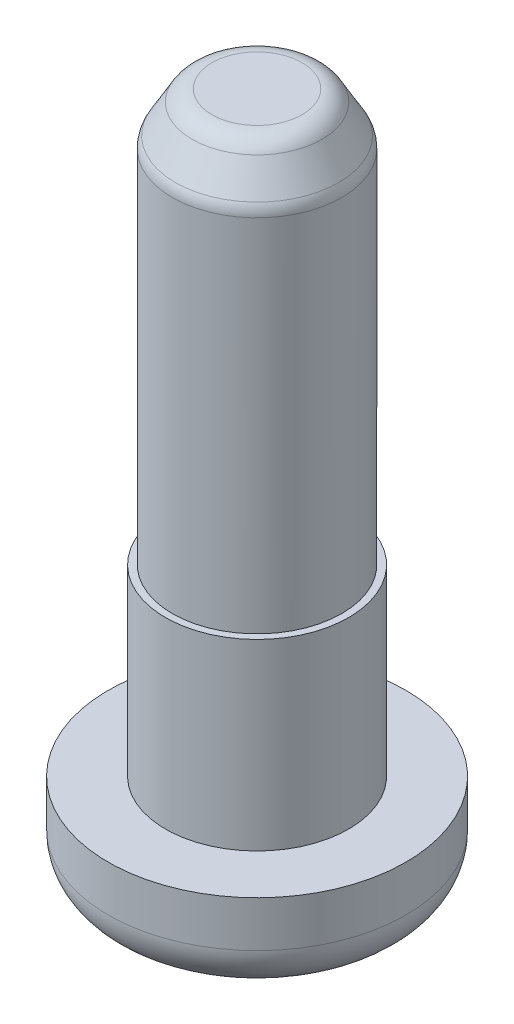
ISO-10303-21;
HEADER;
FILE_DESCRIPTION(('STEP AP214'),'2;1');
FILE_NAME('part.step','',(''),(''),'','','');
FILE_SCHEMA(('AUTOMOTIVE_DESIGN { 1 0 10303 214 1 1 1 1 }'));
ENDSEC;
DATA;
#1=APPLICATION_CONTEXT('core data for automotive mechanical design processes');
#2=APPLICATION_PROTOCOL_DEFINITION('international standard','automotive_design',2000,#1);
#3=PRODUCT_CONTEXT('',#1,'mechanical');
#4=PRODUCT('Part','Part','',(#3));
#5=PRODUCT_RELATED_PRODUCT_CATEGORY('part','',(#4));
#6=PRODUCT_DEFINITION_FORMATION('','',#4);
#7=PRODUCT_DEFINITION_CONTEXT('part definition',#1,'design');
#8=PRODUCT_DEFINITION('design','',#6,#7);
#9=PRODUCT_DEFINITION_SHAPE('','',#8);
#10=(LENGTH_UNIT() NAMED_UNIT(*) SI_UNIT(.MILLI.,.METRE.));
#11=(NAMED_UNIT(*) PLANE_ANGLE_UNIT() SI_UNIT($,.RADIAN.));
#12=(NAMED_UNIT(*) SI_UNIT($,.STERADIAN.) SOLID_ANGLE_UNIT());
#13=UNCERTAINTY_MEASURE_WITH_UNIT(LENGTH_MEASURE(1.E-05),#10,'distance_accuracy_value','');
#14=(GEOMETRIC_REPRESENTATION_CONTEXT(3) GLOBAL_UNCERTAINTY_ASSIGNED_CONTEXT((#13)) GLOBAL_UNIT_ASSIGNED_CONTEXT((#10,
#11,#12)) REPRESENTATION_CONTEXT('',''));
#15=CARTESIAN_POINT('',(0.,0.,0.));
#16=DIRECTION('',(0.,0.,1.));
#17=DIRECTION('',(1.,0.,0.));
#18=AXIS2_PLACEMENT_3D('',#15,#16,#17);
#19=CARTESIAN_POINT('',(0.,26.,0.));
#20=DIRECTION('',(0.,-1.,0.));
#21=DIRECTION('',(0.,0.,-1.));
#22=AXIS2_PLACEMENT_3D('',#19,#20,#21);
#23=CYLINDRICAL_SURFACE('',#22,4.);
#24=CARTESIAN_POINT('',(0.,8.,0.));
#25=DIRECTION('',(0.,-1.,0.));
#26=DIRECTION('',(0.,0.,-1.));
#27=AXIS2_PLACEMENT_3D('',#24,#25,#26);
#28=CIRCLE('',#27,4.);
#29=CARTESIAN_POINT('',(0.,8.,-4.));
#30=VERTEX_POINT('',#29);
#31=EDGE_CURVE('E67',#30,#30,#28,.F.);
#32=CARTESIAN_POINT('',(0.,0.,0.));
#33=DIRECTION('',(0.,1.,0.));
#34=DIRECTION('',(0.,0.,1.));
#35=AXIS2_PLACEMENT_3D('',#32,#33,#34);
#36=CIRCLE('',#35,4.);
#37=CARTESIAN_POINT('',(0.,0.,-4.));
#38=VERTEX_POINT('',#37);
#39=EDGE_CURVE('E60',#38,#38,#36,.T.);
#40=CARTESIAN_POINT('',(0.,8.,-4.));
#41=CARTESIAN_POINT('',(0.,7.91666666666667,-4.));
#42=CARTESIAN_POINT('',(0.,7.83333333333333,-4.));
#43=CARTESIAN_POINT('',(0.,7.66666666666667,-4.));
#44=CARTESIAN_POINT('',(0.,7.58333333333333,-4.));
#45=CARTESIAN_POINT('',(0.,7.41666666666667,-4.));
#46=CARTESIAN_POINT('',(0.,7.33333333333333,-4.));
#47=CARTESIAN_POINT('',(0.,7.16666666666667,-4.));
#48=CARTESIAN_POINT('',(0.,7.08333333333333,-4.));
#49=CARTESIAN_POINT('',(0.,6.91666666666667,-4.));
#50=CARTESIAN_POINT('',(0.,6.83333333333333,-4.));
#51=CARTESIAN_POINT('',(0.,6.66666666666667,-4.));
#52=CARTESIAN_POINT('',(0.,6.58333333333333,-4.));
#53=CARTESIAN_POINT('',(0.,6.41666666666667,-4.));
#54=CARTESIAN_POINT('',(0.,6.33333333333333,-4.));
#55=CARTESIAN_POINT('',(0.,6.16666666666667,-4.));
#56=CARTESIAN_POINT('',(0.,6.08333333333333,-4.));
#57=CARTESIAN_POINT('',(0.,5.91666666666666,-4.));
#58=CARTESIAN_POINT('',(0.,5.83333333333333,-4.));
#59=CARTESIAN_POINT('',(0.,5.66666666666667,-4.));
#60=CARTESIAN_POINT('',(0.,5.58333333333333,-4.));
#61=CARTESIAN_POINT('',(0.,5.41666666666667,-4.));
#62=CARTESIAN_POINT('',(0.,5.33333333333333,-4.));
#63=CARTESIAN_POINT('',(0.,5.16666666666667,-4.));
#64=CARTESIAN_POINT('',(0.,5.08333333333333,-4.));
#65=CARTESIAN_POINT('',(0.,4.91666666666667,-4.));
#66=CARTESIAN_POINT('',(0.,4.83333333333333,-4.));
#67=CARTESIAN_POINT('',(0.,4.66666666666667,-4.));
#68=CARTESIAN_POINT('',(0.,4.58333333333333,-4.));
#69=CARTESIAN_POINT('',(0.,4.41666666666667,-4.));
#70=CARTESIAN_POINT('',(0.,4.33333333333333,-4.));
#71=CARTESIAN_POINT('',(0.,4.16666666666667,-4.));
#72=CARTESIAN_POINT('',(0.,4.08333333333333,-4.));
#73=CARTESIAN_POINT('',(0.,3.91666666666667,-4.));
#74=CARTESIAN_POINT('',(0.,3.83333333333333,-4.));
#75=CARTESIAN_POINT('',(0.,3.66666666666667,-4.));
#76=CARTESIAN_POINT('',(0.,3.58333333333333,-4.));
#77=CARTESIAN_POINT('',(0.,3.41666666666667,-4.));
#78=CARTESIAN_POINT('',(0.,3.33333333333333,-4.));
#79=CARTESIAN_POINT('',(0.,3.16666666666667,-4.));
#80=CARTESIAN_POINT('',(0.,3.08333333333333,-4.));
#81=CARTESIAN_POINT('',(0.,2.91666666666667,-4.));
#82=CARTESIAN_POINT('',(0.,2.83333333333333,-4.));
#83=CARTESIAN_POINT('',(0.,2.66666666666667,-4.));
#84=CARTESIAN_POINT('',(0.,2.58333333333333,-4.));
#85=CARTESIAN_POINT('',(0.,2.41666666666667,-4.));
#86=CARTESIAN_POINT('',(0.,2.33333333333334,-4.));
#87=CARTESIAN_POINT('',(0.,2.16666666666667,-4.));
#88=CARTESIAN_POINT('',(0.,2.08333333333334,-4.));
#89=CARTESIAN_POINT('',(0.,1.91666666666667,-4.));
#90=CARTESIAN_POINT('',(0.,1.83333333333334,-4.));
#91=CARTESIAN_POINT('',(0.,1.66666666666667,-4.));
#92=CARTESIAN_POINT('',(0.,1.58333333333333,-4.));
#93=CARTESIAN_POINT('',(0.,1.41666666666667,-4.));
#94=CARTESIAN_POINT('',(0.,1.33333333333333,-4.));
#95=CARTESIAN_POINT('',(0.,1.16666666666667,-4.));
#96=CARTESIAN_POINT('',(0.,1.08333333333333,-4.));
#97=CARTESIAN_POINT('',(0.,0.916666666666668,-4.));
#98=CARTESIAN_POINT('',(0.,0.833333333333334,-4.));
#99=CARTESIAN_POINT('',(0.,0.666666666666667,-4.));
#100=CARTESIAN_POINT('',(0.,0.583333333333334,-4.));
#101=CARTESIAN_POINT('',(0.,0.416666666666667,-4.));
#102=CARTESIAN_POINT('',(0.,0.333333333333334,-4.));
#103=CARTESIAN_POINT('',(0.,0.166666666666667,-4.));
#104=CARTESIAN_POINT('',(0.,0.0833333333333333,-4.));
#105=CARTESIAN_POINT('',(0.,0.,-4.));
#106=B_SPLINE_CURVE_WITH_KNOTS('',3,(#40,#41,#42,#43,#44,#45,#46,#47,#48,#49,#50,#51,#52,#53,
#54,#55,#56,#57,#58,#59,#60,#61,#62,#63,#64,#65,#66,#67,#68,#69,#70,#71,#72,#73,#74,#75,#76,#77,
#78,#79,#80,#81,#82,#83,#84,#85,#86,#87,#88,#89,#90,#91,#92,#93,#94,#95,#96,#97,#98,#99,#100,
#101,#102,#103,#104,#105),.UNSPECIFIED.,.F.,.F.,(4,2,2,2,2,2,2,2,2,2,2,2,2,2,2,2,2,2,2,2,2,2,2,
2,2,2,2,2,2,2,2,2,4),(0.,0.25,0.5,0.750000000000001,1.,1.25,1.5,1.75,2.,2.25,2.5,2.75,3.,3.25,
3.5,3.75,4.,4.25,4.5,4.75,5.,5.25,5.5,5.75,6.,6.25,6.5,6.75,7.,7.25,7.5,7.75,8.),.UNSPECIFIED.);
#107=EDGE_CURVE('BSEAM34',#30,#38,#106,.T.);
#108=ORIENTED_EDGE('',*,*,#31,.F.);
#109=ORIENTED_EDGE('',*,*,#39,.T.);
#110=ORIENTED_EDGE('',*,*,#107,.T.);
#111=ORIENTED_EDGE('',*,*,#107,.F.);
#112=EDGE_LOOP('',(#108,#110,#109,#111));
#113=FACE_BOUND('',#112,.T.);
#114=ADVANCED_FACE('F34',(#113),#23,.T.);
#115=CARTESIAN_POINT('',(0.,-4.,0.));
#116=DIRECTION('',(0.,1.,0.));
#117=DIRECTION('',(0.,0.,1.));
#118=AXIS2_PLACEMENT_3D('',#115,#116,#117);
#119=CYLINDRICAL_SURFACE('',#118,6.5);
#120=CARTESIAN_POINT('',(0.,-2.,0.));
#121=DIRECTION('',(0.,-1.,0.));
#122=DIRECTION('',(0.,0.,-1.));
#123=AXIS2_PLACEMENT_3D('',#120,#121,#122);
#124=CIRCLE('',#123,6.5);
#125=CARTESIAN_POINT('',(0.,-2.,-6.5));
#126=VERTEX_POINT('',#125);
#127=EDGE_CURVE('E54',#126,#126,#124,.F.);
#128=ORIENTED_EDGE('',*,*,#127,.T.);
#129=EDGE_LOOP('',(#128));
#130=FACE_BOUND('',#129,.T.);
#131=CARTESIAN_POINT('',(0.,0.,0.));
#132=DIRECTION('',(0.,-1.,0.));
#133=DIRECTION('',(0.,0.,-1.));
#134=AXIS2_PLACEMENT_3D('',#131,#132,#133);
#135=CIRCLE('',#134,6.5);
#136=CARTESIAN_POINT('',(0.,0.,-6.5));
#137=VERTEX_POINT('',#136);
#138=EDGE_CURVE('E63',#137,#137,#135,.T.);
#139=ORIENTED_EDGE('',*,*,#138,.T.);
#140=EDGE_LOOP('',(#139));
#141=FACE_BOUND('',#140,.T.);
#142=ADVANCED_FACE('F91',(#130,#141),#119,.T.);
#143=CARTESIAN_POINT('',(0.,-4.,0.));
#144=DIRECTION('',(0.,-1.,0.));
#145=DIRECTION('',(0.,0.,-1.));
#146=AXIS2_PLACEMENT_3D('',#143,#144,#145);
#147=PLANE('',#146);
#148=CARTESIAN_POINT('',(0.,-4.,0.));
#149=DIRECTION('',(0.,-1.,0.));
#150=DIRECTION('',(0.,0.,-1.));
#151=AXIS2_PLACEMENT_3D('',#148,#149,#150);
#152=CIRCLE('',#151,4.5);
#153=CARTESIAN_POINT('',(0.,-4.,-4.5));
#154=VERTEX_POINT('',#153);
#155=EDGE_CURVE('E57',#154,#154,#152,.T.);
#156=ORIENTED_EDGE('',*,*,#155,.T.);
#157=EDGE_LOOP('',(#156));
#158=FACE_BOUND('',#157,.T.);
#159=ADVANCED_FACE('F97',(#158),#147,.T.);
#160=CARTESIAN_POINT('',(0.,0.,0.));
#161=DIRECTION('',(0.,-1.,0.));
#162=DIRECTION('',(0.,0.,-1.));
#163=AXIS2_PLACEMENT_3D('',#160,#161,#162);
#164=PLANE('',#163);
#165=ORIENTED_EDGE('',*,*,#39,.F.);
#166=EDGE_LOOP('',(#165));
#167=FACE_BOUND('',#166,.T.);
#168=ORIENTED_EDGE('',*,*,#138,.F.);
#169=EDGE_LOOP('',(#168));
#170=FACE_BOUND('',#169,.T.);
#171=ADVANCED_FACE('F86',(#167,#170),#164,.F.);
#172=CARTESIAN_POINT('',(0.,-11.3137084989848,0.));
#173=DIRECTION('',(0.,1.,0.));
#174=DIRECTION('',(0.,0.,1.));
#175=AXIS2_PLACEMENT_3D('',#172,#173,#174);
#176=CYLINDRICAL_SURFACE('',#175,3.7);
#177=CARTESIAN_POINT('',(0.,23.7320508075689,0.));
#178=DIRECTION('',(0.,1.,0.));
#179=DIRECTION('',(0.,0.,1.));
#180=AXIS2_PLACEMENT_3D('',#177,#178,#179);
#181=CIRCLE('',#180,3.7);
#182=CARTESIAN_POINT('',(0.,23.7320508075689,3.7));
#183=VERTEX_POINT('',#182);
#184=EDGE_CURVE('E49',#183,#183,#181,.F.);
#185=ORIENTED_EDGE('',*,*,#184,.T.);
#186=EDGE_LOOP('',(#185));
#187=FACE_BOUND('',#186,.T.);
#188=CARTESIAN_POINT('',(0.,8.,0.));
#189=DIRECTION('',(0.,-1.,0.));
#190=DIRECTION('',(0.,0.,-1.));
#191=AXIS2_PLACEMENT_3D('',#188,#189,#190);
#192=CIRCLE('',#191,3.7);
#193=CARTESIAN_POINT('',(0.,8.,-3.7));
#194=VERTEX_POINT('',#193);
#195=EDGE_CURVE('E66',#194,#194,#192,.F.);
#196=ORIENTED_EDGE('',*,*,#195,.T.);
#197=EDGE_LOOP('',(#196));
#198=FACE_BOUND('',#197,.T.);
#199=ADVANCED_FACE('F73',(#187,#198),#176,.T.);
#200=CARTESIAN_POINT('',(0.,8.,0.));
#201=DIRECTION('',(0.,-1.,0.));
#202=DIRECTION('',(0.,0.,-1.));
#203=AXIS2_PLACEMENT_3D('',#200,#201,#202);
#204=PLANE('',#203);
#205=ORIENTED_EDGE('',*,*,#31,.T.);
#206=EDGE_LOOP('',(#205));
#207=FACE_BOUND('',#206,.T.);
#208=ORIENTED_EDGE('',*,*,#195,.F.);
#209=EDGE_LOOP('',(#208));
#210=FACE_BOUND('',#209,.T.);
#211=ADVANCED_FACE('F75',(#207,#210),#204,.F.);
#212=CARTESIAN_POINT('',(0.,26.,0.));
#213=DIRECTION('',(0.,1.,0.));
#214=DIRECTION('',(0.,0.,1.));
#215=AXIS2_PLACEMENT_3D('',#212,#213,#214);
#216=PLANE('',#215);
#217=CARTESIAN_POINT('',(0.,26.,0.));
#218=DIRECTION('',(0.,1.,0.));
#219=DIRECTION('',(0.,0.,1.));
#220=AXIS2_PLACEMENT_3D('',#217,#218,#219);
#221=CIRCLE('',#220,1.96794919243112);
#222=CARTESIAN_POINT('',(0.,26.,1.96794919243112));
#223=VERTEX_POINT('',#222);
#224=EDGE_CURVE('E12',#223,#223,#221,.T.);
#225=ORIENTED_EDGE('',*,*,#224,.T.);
#226=EDGE_LOOP('',(#225));
#227=FACE_BOUND('',#226,.T.);
#228=ADVANCED_FACE('F77',(#227),#216,.T.);
#229=CARTESIAN_POINT('',(0.,-2.,0.));
#230=DIRECTION('',(0.,-1.,0.));
#231=DIRECTION('',(0.,0.,-1.));
#232=AXIS2_PLACEMENT_3D('',#229,#230,#231);
#233=TOROIDAL_SURFACE('',#232,4.5,2.);
#234=ORIENTED_EDGE('',*,*,#127,.F.);
#235=EDGE_LOOP('',(#234));
#236=FACE_BOUND('',#235,.T.);
#237=ORIENTED_EDGE('',*,*,#155,.F.);
#238=EDGE_LOOP('',(#237));
#239=FACE_BOUND('',#238,.T.);
#240=ADVANCED_FACE('F84',(#236,#239),#233,.T.);
#241=CARTESIAN_POINT('',(0.,26.,0.));
#242=DIRECTION('',(0.,-1.,0.));
#243=DIRECTION('',(0.,0.,-1.));
#244=AXIS2_PLACEMENT_3D('',#241,#242,#243);
#245=CONICAL_SURFACE('',#244,2.54529946162075,0.523598775598296);
#246=CARTESIAN_POINT('',(0.,24.2320508075689,0.));
#247=DIRECTION('',(0.,1.,0.));
#248=DIRECTION('',(0.,0.,1.));
#249=AXIS2_PLACEMENT_3D('',#246,#247,#248);
#250=CIRCLE('',#249,3.56602540378444);
#251=CARTESIAN_POINT('',(0.,24.2320508075689,3.56602540378444));
#252=VERTEX_POINT('',#251);
#253=EDGE_CURVE('E41',#252,#252,#250,.T.);
#254=ORIENTED_EDGE('',*,*,#253,.T.);
#255=EDGE_LOOP('',(#254));
#256=FACE_BOUND('',#255,.T.);
#257=CARTESIAN_POINT('',(0.,25.5,0.));
#258=DIRECTION('',(0.,1.,0.));
#259=DIRECTION('',(0.,0.,1.));
#260=AXIS2_PLACEMENT_3D('',#257,#258,#259);
#261=CIRCLE('',#260,2.83397459621556);
#262=CARTESIAN_POINT('',(0.,25.5,2.83397459621556));
#263=VERTEX_POINT('',#262);
#264=EDGE_CURVE('E45',#263,#263,#261,.F.);
#265=ORIENTED_EDGE('',*,*,#264,.T.);
#266=EDGE_LOOP('',(#265));
#267=FACE_BOUND('',#266,.T.);
#268=ADVANCED_FACE('F105',(#256,#267),#245,.T.);
#269=CARTESIAN_POINT('',(0.,23.7320508075689,0.));
#270=DIRECTION('',(0.,1.,0.));
#271=DIRECTION('',(0.,0.,1.));
#272=AXIS2_PLACEMENT_3D('',#269,#270,#271);
#273=TOROIDAL_SURFACE('',#272,2.7,1.);
#274=ORIENTED_EDGE('',*,*,#253,.F.);
#275=EDGE_LOOP('',(#274));
#276=FACE_BOUND('',#275,.T.);
#277=ORIENTED_EDGE('',*,*,#184,.F.);
#278=EDGE_LOOP('',(#277));
#279=FACE_BOUND('',#278,.T.);
#280=ADVANCED_FACE('F108',(#276,#279),#273,.T.);
#281=CARTESIAN_POINT('',(0.,25.,0.));
#282=DIRECTION('',(0.,1.,0.));
#283=DIRECTION('',(0.,0.,1.));
#284=AXIS2_PLACEMENT_3D('',#281,#282,#283);
#285=TOROIDAL_SURFACE('',#284,1.96794919243112,1.);
#286=ORIENTED_EDGE('',*,*,#264,.F.);
#287=EDGE_LOOP('',(#286));
#288=FACE_BOUND('',#287,.T.);
#289=ORIENTED_EDGE('',*,*,#224,.F.);
#290=EDGE_LOOP('',(#289));
#291=FACE_BOUND('',#290,.T.);
#292=ADVANCED_FACE('F36',(#288,#291),#285,.T.);
#293=CLOSED_SHELL('',(#114,#142,#159,#171,#199,#211,#228,#240,#268,#280,#292));
#294=MANIFOLD_SOLID_BREP('B2',#293);
#295=ADVANCED_BREP_SHAPE_REPRESENTATION('',(#18,#294),#14);
#296=SHAPE_DEFINITION_REPRESENTATION(#9,#295);
ENDSEC;
END-ISO-10303-21;
